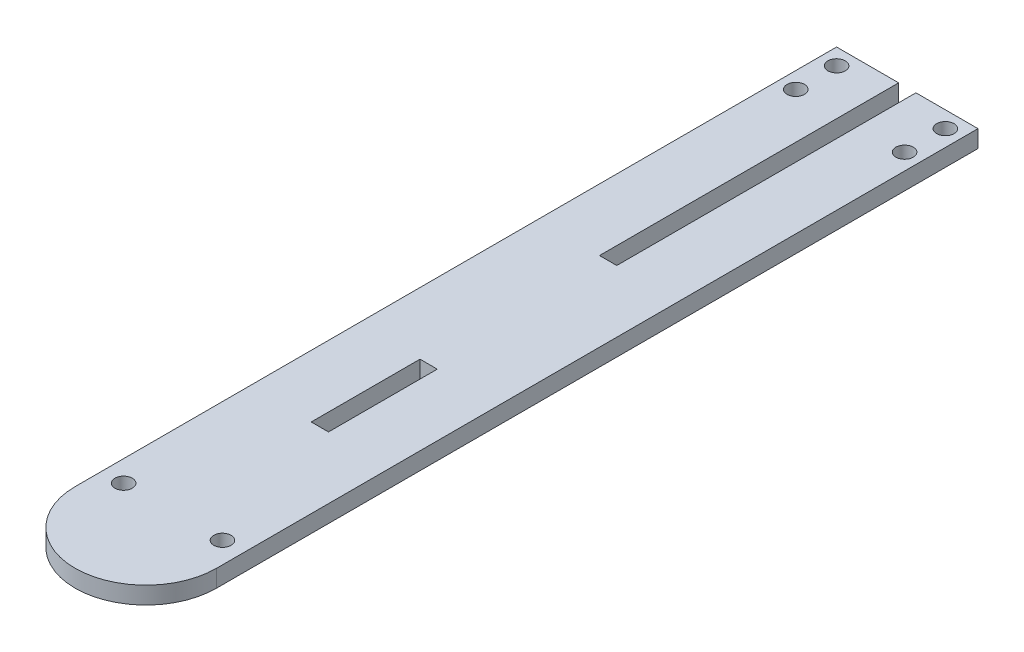
ISO-10303-21;
HEADER;
FILE_DESCRIPTION(('STEP AP214'),'2;1');
FILE_NAME('part.step','',(''),(''),'','','');
FILE_SCHEMA(('AUTOMOTIVE_DESIGN { 1 0 10303 214 1 1 1 1 }'));
ENDSEC;
DATA;
#1=APPLICATION_CONTEXT('core data for automotive mechanical design processes');
#2=APPLICATION_PROTOCOL_DEFINITION('international standard','automotive_design',2000,#1);
#3=PRODUCT_CONTEXT('',#1,'mechanical');
#4=PRODUCT('Part','Part','',(#3));
#5=PRODUCT_RELATED_PRODUCT_CATEGORY('part','',(#4));
#6=PRODUCT_DEFINITION_FORMATION('','',#4);
#7=PRODUCT_DEFINITION_CONTEXT('part definition',#1,'design');
#8=PRODUCT_DEFINITION('design','',#6,#7);
#9=PRODUCT_DEFINITION_SHAPE('','',#8);
#10=(LENGTH_UNIT() NAMED_UNIT(*) SI_UNIT(.MILLI.,.METRE.));
#11=(NAMED_UNIT(*) PLANE_ANGLE_UNIT() SI_UNIT($,.RADIAN.));
#12=(NAMED_UNIT(*) SI_UNIT($,.STERADIAN.) SOLID_ANGLE_UNIT());
#13=UNCERTAINTY_MEASURE_WITH_UNIT(LENGTH_MEASURE(1.E-05),#10,'distance_accuracy_value','');
#14=(GEOMETRIC_REPRESENTATION_CONTEXT(3) GLOBAL_UNCERTAINTY_ASSIGNED_CONTEXT((#13)) GLOBAL_UNIT_ASSIGNED_CONTEXT((#10,
#11,#12)) REPRESENTATION_CONTEXT('',''));
#15=CARTESIAN_POINT('',(0.,0.,0.));
#16=DIRECTION('',(0.,0.,1.));
#17=DIRECTION('',(1.,0.,0.));
#18=AXIS2_PLACEMENT_3D('',#15,#16,#17);
#19=CARTESIAN_POINT('',(-1.58749999999998,3.175,140.));
#20=DIRECTION('',(0.,1.,0.));
#21=DIRECTION('',(0.,0.,1.));
#22=AXIS2_PLACEMENT_3D('',#19,#20,#21);
#23=PLANE('',#22);
#24=CARTESIAN_POINT('',(-10.675,3.175,135.));
#25=DIRECTION('',(0.,1.,0.));
#26=DIRECTION('',(0.,0.,1.));
#27=AXIS2_PLACEMENT_3D('',#24,#25,#26);
#28=CIRCLE('',#27,1.59999999999999);
#29=CARTESIAN_POINT('',(-10.675,3.175,136.6));
#30=VERTEX_POINT('',#29);
#31=EDGE_CURVE('E419',#30,#30,#28,.T.);
#32=ORIENTED_EDGE('',*,*,#31,.F.);
#33=EDGE_LOOP('',(#32));
#34=FACE_BOUND('',#33,.T.);
#35=CARTESIAN_POINT('',(7.50000000000002,3.175,135.));
#36=DIRECTION('',(0.,1.,0.));
#37=DIRECTION('',(0.,0.,1.));
#38=AXIS2_PLACEMENT_3D('',#35,#36,#37);
#39=CIRCLE('',#38,1.59999999999999);
#40=CARTESIAN_POINT('',(7.50000000000002,3.175,136.6));
#41=VERTEX_POINT('',#40);
#42=EDGE_CURVE('E424',#41,#41,#39,.T.);
#43=ORIENTED_EDGE('',*,*,#42,.F.);
#44=EDGE_LOOP('',(#43));
#45=FACE_BOUND('',#44,.T.);
#46=CARTESIAN_POINT('',(-11.5875,3.175,3.00000000000001));
#47=DIRECTION('',(0.,-1.,0.));
#48=DIRECTION('',(0.,0.,-1.));
#49=AXIS2_PLACEMENT_3D('',#46,#47,#48);
#50=CIRCLE('',#49,1.6);
#51=CARTESIAN_POINT('',(-11.5875,3.175,1.40000000000001));
#52=VERTEX_POINT('',#51);
#53=EDGE_CURVE('E416',#52,#52,#50,.T.);
#54=ORIENTED_EDGE('',*,*,#53,.T.);
#55=EDGE_LOOP('',(#54));
#56=FACE_BOUND('',#55,.T.);
#57=CARTESIAN_POINT('',(-11.5875,3.175,10.5));
#58=DIRECTION('',(0.,-1.,0.));
#59=DIRECTION('',(0.,0.,-1.));
#60=AXIS2_PLACEMENT_3D('',#57,#58,#59);
#61=CIRCLE('',#60,1.6);
#62=CARTESIAN_POINT('',(-11.5875,3.175,8.90000000000001));
#63=VERTEX_POINT('',#62);
#64=EDGE_CURVE('E412',#63,#63,#61,.T.);
#65=ORIENTED_EDGE('',*,*,#64,.T.);
#66=EDGE_LOOP('',(#65));
#67=FACE_BOUND('',#66,.T.);
#68=CARTESIAN_POINT('',(8.41250000000003,3.175,10.5));
#69=DIRECTION('',(0.,-1.,0.));
#70=DIRECTION('',(0.,0.,-1.));
#71=AXIS2_PLACEMENT_3D('',#68,#69,#70);
#72=CIRCLE('',#71,1.6);
#73=CARTESIAN_POINT('',(8.41250000000003,3.175,8.9));
#74=VERTEX_POINT('',#73);
#75=EDGE_CURVE('E405',#74,#74,#72,.T.);
#76=ORIENTED_EDGE('',*,*,#75,.T.);
#77=EDGE_LOOP('',(#76));
#78=FACE_BOUND('',#77,.T.);
#79=CARTESIAN_POINT('',(8.41250000000003,3.175,3.00000000000001));
#80=DIRECTION('',(0.,-1.,0.));
#81=DIRECTION('',(0.,0.,-1.));
#82=AXIS2_PLACEMENT_3D('',#79,#80,#81);
#83=CIRCLE('',#82,1.6);
#84=CARTESIAN_POINT('',(8.41250000000003,3.175,1.40000000000001));
#85=VERTEX_POINT('',#84);
#86=EDGE_CURVE('E217',#85,#85,#83,.T.);
#87=ORIENTED_EDGE('',*,*,#86,.T.);
#88=EDGE_LOOP('',(#87));
#89=FACE_BOUND('',#88,.T.);
#90=DIRECTION('',(-1.,0.,0.));
#91=VECTOR('',#90,1.);
#92=CARTESIAN_POINT('',(-14.5875,3.175,0.));
#93=LINE('',#92,#91);
#94=CARTESIAN_POINT('',(-3.175,3.175,0.));
#95=VERTEX_POINT('',#94);
#96=CARTESIAN_POINT('',(-14.5875,3.175,0.));
#97=VERTEX_POINT('',#96);
#98=EDGE_CURVE('E160',#95,#97,#93,.T.);
#99=ORIENTED_EDGE('',*,*,#98,.T.);
#100=DIRECTION('',(0.,0.,1.));
#101=VECTOR('',#100,1.);
#102=CARTESIAN_POINT('',(-14.5875,3.175,0.));
#103=LINE('',#102,#101);
#104=CARTESIAN_POINT('',(-14.5875,3.175,140.));
#105=VERTEX_POINT('',#104);
#106=EDGE_CURVE('E163',#97,#105,#103,.T.);
#107=ORIENTED_EDGE('',*,*,#106,.T.);
#108=CARTESIAN_POINT('',(-1.58749999999998,3.175,140.));
#109=DIRECTION('',(0.,1.,0.));
#110=DIRECTION('',(0.,0.,1.));
#111=AXIS2_PLACEMENT_3D('',#108,#109,#110);
#112=CIRCLE('',#111,13.);
#113=CARTESIAN_POINT('',(11.4125,3.175,140.));
#114=VERTEX_POINT('',#113);
#115=EDGE_CURVE('E166',#105,#114,#112,.T.);
#116=ORIENTED_EDGE('',*,*,#115,.T.);
#117=DIRECTION('',(0.,0.,-1.));
#118=VECTOR('',#117,1.);
#119=CARTESIAN_POINT('',(11.4125,3.175,0.));
#120=LINE('',#119,#118);
#121=CARTESIAN_POINT('',(11.4125,3.175,0.));
#122=VERTEX_POINT('',#121);
#123=EDGE_CURVE('E168',#114,#122,#120,.T.);
#124=ORIENTED_EDGE('',*,*,#123,.T.);
#125=DIRECTION('',(-1.,0.,0.));
#126=VECTOR('',#125,1.);
#127=CARTESIAN_POINT('',(11.4125,3.175,0.));
#128=LINE('',#127,#126);
#129=CARTESIAN_POINT('',(0.,3.175,0.));
#130=VERTEX_POINT('',#129);
#131=EDGE_CURVE('E170',#122,#130,#128,.T.);
#132=ORIENTED_EDGE('',*,*,#131,.T.);
#133=DIRECTION('',(0.,0.,1.));
#134=VECTOR('',#133,1.);
#135=CARTESIAN_POINT('',(0.,3.175,0.));
#136=LINE('',#135,#134);
#137=CARTESIAN_POINT('',(0.,3.175,55.));
#138=VERTEX_POINT('',#137);
#139=EDGE_CURVE('E172',#130,#138,#136,.T.);
#140=ORIENTED_EDGE('',*,*,#139,.T.);
#141=DIRECTION('',(-1.,0.,0.));
#142=VECTOR('',#141,1.);
#143=CARTESIAN_POINT('',(-3.175,3.175,55.));
#144=LINE('',#143,#142);
#145=CARTESIAN_POINT('',(-3.175,3.175,55.));
#146=VERTEX_POINT('',#145);
#147=EDGE_CURVE('E174',#138,#146,#144,.T.);
#148=ORIENTED_EDGE('',*,*,#147,.T.);
#149=DIRECTION('',(0.,0.,-1.));
#150=VECTOR('',#149,1.);
#151=CARTESIAN_POINT('',(-3.175,3.175,0.));
#152=LINE('',#151,#150);
#153=EDGE_CURVE('E176',#146,#95,#152,.T.);
#154=ORIENTED_EDGE('',*,*,#153,.T.);
#155=EDGE_LOOP('',(#99,#107,#116,#124,#132,#140,#148,#154));
#156=FACE_BOUND('',#155,.T.);
#157=DIRECTION('',(1.,0.,0.));
#158=VECTOR('',#157,1.);
#159=CARTESIAN_POINT('',(-3.175,3.175,108.));
#160=LINE('',#159,#158);
#161=CARTESIAN_POINT('',(-3.175,3.175,108.));
#162=VERTEX_POINT('',#161);
#163=CARTESIAN_POINT('',(0.,3.175,108.));
#164=VERTEX_POINT('',#163);
#165=EDGE_CURVE('E131',#162,#164,#160,.T.);
#166=ORIENTED_EDGE('',*,*,#165,.F.);
#167=DIRECTION('',(0.,0.,1.));
#168=VECTOR('',#167,1.);
#169=CARTESIAN_POINT('',(-3.175,3.175,88.));
#170=LINE('',#169,#168);
#171=CARTESIAN_POINT('',(-3.175,3.175,88.));
#172=VERTEX_POINT('',#171);
#173=EDGE_CURVE('E123',#172,#162,#170,.T.);
#174=ORIENTED_EDGE('',*,*,#173,.F.);
#175=DIRECTION('',(-1.,0.,0.));
#176=VECTOR('',#175,1.);
#177=CARTESIAN_POINT('',(-3.175,3.175,88.));
#178=LINE('',#177,#176);
#179=CARTESIAN_POINT('',(0.,3.175,88.));
#180=VERTEX_POINT('',#179);
#181=EDGE_CURVE('E145',#180,#172,#178,.T.);
#182=ORIENTED_EDGE('',*,*,#181,.F.);
#183=DIRECTION('',(0.,0.,-1.));
#184=VECTOR('',#183,1.);
#185=CARTESIAN_POINT('',(0.,3.175,88.));
#186=LINE('',#185,#184);
#187=EDGE_CURVE('E143',#164,#180,#186,.T.);
#188=ORIENTED_EDGE('',*,*,#187,.F.);
#189=EDGE_LOOP('',(#166,#174,#182,#188));
#190=FACE_BOUND('',#189,.T.);
#191=ADVANCED_FACE('F32',(#34,#45,#56,#67,#78,#89,#156,#190),#23,.T.);
#192=CARTESIAN_POINT('',(-1.58749999999998,0.,140.));
#193=DIRECTION('',(0.,1.,0.));
#194=DIRECTION('',(0.,0.,1.));
#195=AXIS2_PLACEMENT_3D('',#192,#193,#194);
#196=PLANE('',#195);
#197=CARTESIAN_POINT('',(-10.675,0.,135.));
#198=DIRECTION('',(0.,1.,0.));
#199=DIRECTION('',(0.,0.,1.));
#200=AXIS2_PLACEMENT_3D('',#197,#198,#199);
#201=CIRCLE('',#200,1.59999999999999);
#202=CARTESIAN_POINT('',(-10.675,0.,136.6));
#203=VERTEX_POINT('',#202);
#204=EDGE_CURVE('E426',#203,#203,#201,.T.);
#205=ORIENTED_EDGE('',*,*,#204,.T.);
#206=EDGE_LOOP('',(#205));
#207=FACE_BOUND('',#206,.T.);
#208=CARTESIAN_POINT('',(7.50000000000002,0.,135.));
#209=DIRECTION('',(0.,1.,0.));
#210=DIRECTION('',(0.,0.,1.));
#211=AXIS2_PLACEMENT_3D('',#208,#209,#210);
#212=CIRCLE('',#211,1.59999999999999);
#213=CARTESIAN_POINT('',(7.50000000000002,0.,136.6));
#214=VERTEX_POINT('',#213);
#215=EDGE_CURVE('E429',#214,#214,#212,.T.);
#216=ORIENTED_EDGE('',*,*,#215,.T.);
#217=EDGE_LOOP('',(#216));
#218=FACE_BOUND('',#217,.T.);
#219=CARTESIAN_POINT('',(-11.5875,0.,3.00000000000001));
#220=DIRECTION('',(0.,1.,0.));
#221=DIRECTION('',(0.,0.,1.));
#222=AXIS2_PLACEMENT_3D('',#219,#220,#221);
#223=CIRCLE('',#222,1.6);
#224=CARTESIAN_POINT('',(-11.5875,0.,4.60000000000002));
#225=VERTEX_POINT('',#224);
#226=EDGE_CURVE('E36',#225,#225,#223,.T.);
#227=ORIENTED_EDGE('',*,*,#226,.T.);
#228=EDGE_LOOP('',(#227));
#229=FACE_BOUND('',#228,.T.);
#230=CARTESIAN_POINT('',(-11.5875,0.,10.5));
#231=DIRECTION('',(0.,1.,0.));
#232=DIRECTION('',(0.,0.,1.));
#233=AXIS2_PLACEMENT_3D('',#230,#231,#232);
#234=CIRCLE('',#233,1.6);
#235=CARTESIAN_POINT('',(-11.5875,0.,12.1));
#236=VERTEX_POINT('',#235);
#237=EDGE_CURVE('E219',#236,#236,#234,.T.);
#238=ORIENTED_EDGE('',*,*,#237,.T.);
#239=EDGE_LOOP('',(#238));
#240=FACE_BOUND('',#239,.T.);
#241=CARTESIAN_POINT('',(8.41250000000003,0.,10.5));
#242=DIRECTION('',(0.,1.,0.));
#243=DIRECTION('',(0.,0.,1.));
#244=AXIS2_PLACEMENT_3D('',#241,#242,#243);
#245=CIRCLE('',#244,1.6);
#246=CARTESIAN_POINT('',(8.41250000000003,0.,12.1));
#247=VERTEX_POINT('',#246);
#248=EDGE_CURVE('E216',#247,#247,#245,.T.);
#249=ORIENTED_EDGE('',*,*,#248,.T.);
#250=EDGE_LOOP('',(#249));
#251=FACE_BOUND('',#250,.T.);
#252=CARTESIAN_POINT('',(8.41250000000003,0.,3.00000000000001));
#253=DIRECTION('',(0.,1.,0.));
#254=DIRECTION('',(0.,0.,1.));
#255=AXIS2_PLACEMENT_3D('',#252,#253,#254);
#256=CIRCLE('',#255,1.6);
#257=CARTESIAN_POINT('',(8.41250000000003,0.,4.6));
#258=VERTEX_POINT('',#257);
#259=EDGE_CURVE('E213',#258,#258,#256,.T.);
#260=ORIENTED_EDGE('',*,*,#259,.T.);
#261=EDGE_LOOP('',(#260));
#262=FACE_BOUND('',#261,.T.);
#263=DIRECTION('',(-1.,0.,0.));
#264=VECTOR('',#263,1.);
#265=CARTESIAN_POINT('',(-14.5875,0.,0.));
#266=LINE('',#265,#264);
#267=CARTESIAN_POINT('',(-3.175,0.,0.));
#268=VERTEX_POINT('',#267);
#269=CARTESIAN_POINT('',(-14.5875,0.,0.));
#270=VERTEX_POINT('',#269);
#271=EDGE_CURVE('E139',#268,#270,#266,.T.);
#272=ORIENTED_EDGE('',*,*,#271,.F.);
#273=DIRECTION('',(0.,0.,-1.));
#274=VECTOR('',#273,1.);
#275=CARTESIAN_POINT('',(-3.175,0.,0.));
#276=LINE('',#275,#274);
#277=CARTESIAN_POINT('',(-3.175,0.,55.));
#278=VERTEX_POINT('',#277);
#279=EDGE_CURVE('E164',#278,#268,#276,.T.);
#280=ORIENTED_EDGE('',*,*,#279,.F.);
#281=DIRECTION('',(-1.,0.,0.));
#282=VECTOR('',#281,1.);
#283=CARTESIAN_POINT('',(-3.175,0.,55.));
#284=LINE('',#283,#282);
#285=CARTESIAN_POINT('',(0.,0.,55.));
#286=VERTEX_POINT('',#285);
#287=EDGE_CURVE('E191',#286,#278,#284,.T.);
#288=ORIENTED_EDGE('',*,*,#287,.F.);
#289=DIRECTION('',(0.,0.,1.));
#290=VECTOR('',#289,1.);
#291=CARTESIAN_POINT('',(0.,0.,0.));
#292=LINE('',#291,#290);
#293=CARTESIAN_POINT('',(0.,0.,0.));
#294=VERTEX_POINT('',#293);
#295=EDGE_CURVE('E189',#294,#286,#292,.T.);
#296=ORIENTED_EDGE('',*,*,#295,.F.);
#297=DIRECTION('',(-1.,0.,0.));
#298=VECTOR('',#297,1.);
#299=CARTESIAN_POINT('',(11.4125,0.,0.));
#300=LINE('',#299,#298);
#301=CARTESIAN_POINT('',(11.4125,0.,0.));
#302=VERTEX_POINT('',#301);
#303=EDGE_CURVE('E187',#302,#294,#300,.T.);
#304=ORIENTED_EDGE('',*,*,#303,.F.);
#305=DIRECTION('',(0.,0.,-1.));
#306=VECTOR('',#305,1.);
#307=CARTESIAN_POINT('',(11.4125,0.,0.));
#308=LINE('',#307,#306);
#309=CARTESIAN_POINT('',(11.4125,0.,140.));
#310=VERTEX_POINT('',#309);
#311=EDGE_CURVE('E185',#310,#302,#308,.T.);
#312=ORIENTED_EDGE('',*,*,#311,.F.);
#313=CARTESIAN_POINT('',(-1.58749999999998,0.,140.));
#314=DIRECTION('',(0.,1.,0.));
#315=DIRECTION('',(0.,0.,1.));
#316=AXIS2_PLACEMENT_3D('',#313,#314,#315);
#317=CIRCLE('',#316,13.);
#318=CARTESIAN_POINT('',(-14.5875,0.,140.));
#319=VERTEX_POINT('',#318);
#320=EDGE_CURVE('E183',#319,#310,#317,.T.);
#321=ORIENTED_EDGE('',*,*,#320,.F.);
#322=DIRECTION('',(0.,0.,1.));
#323=VECTOR('',#322,1.);
#324=CARTESIAN_POINT('',(-14.5875,0.,0.));
#325=LINE('',#324,#323);
#326=EDGE_CURVE('E181',#270,#319,#325,.T.);
#327=ORIENTED_EDGE('',*,*,#326,.F.);
#328=EDGE_LOOP('',(#272,#280,#288,#296,#304,#312,#321,#327));
#329=FACE_BOUND('',#328,.T.);
#330=DIRECTION('',(0.,0.,1.));
#331=VECTOR('',#330,1.);
#332=CARTESIAN_POINT('',(-3.175,0.,88.));
#333=LINE('',#332,#331);
#334=CARTESIAN_POINT('',(-3.175,0.,88.));
#335=VERTEX_POINT('',#334);
#336=CARTESIAN_POINT('',(-3.175,0.,108.));
#337=VERTEX_POINT('',#336);
#338=EDGE_CURVE('E57',#335,#337,#333,.T.);
#339=ORIENTED_EDGE('',*,*,#338,.T.);
#340=DIRECTION('',(1.,0.,0.));
#341=VECTOR('',#340,1.);
#342=CARTESIAN_POINT('',(-3.175,0.,108.));
#343=LINE('',#342,#341);
#344=CARTESIAN_POINT('',(0.,0.,108.));
#345=VERTEX_POINT('',#344);
#346=EDGE_CURVE('E138',#337,#345,#343,.T.);
#347=ORIENTED_EDGE('',*,*,#346,.T.);
#348=DIRECTION('',(0.,0.,-1.));
#349=VECTOR('',#348,1.);
#350=CARTESIAN_POINT('',(0.,0.,88.));
#351=LINE('',#350,#349);
#352=CARTESIAN_POINT('',(0.,0.,88.));
#353=VERTEX_POINT('',#352);
#354=EDGE_CURVE('E152',#345,#353,#351,.T.);
#355=ORIENTED_EDGE('',*,*,#354,.T.);
#356=DIRECTION('',(-1.,0.,0.));
#357=VECTOR('',#356,1.);
#358=CARTESIAN_POINT('',(-3.175,0.,88.));
#359=LINE('',#358,#357);
#360=EDGE_CURVE('E132',#353,#335,#359,.T.);
#361=ORIENTED_EDGE('',*,*,#360,.T.);
#362=EDGE_LOOP('',(#339,#347,#355,#361));
#363=FACE_BOUND('',#362,.T.);
#364=ADVANCED_FACE('F226',(#207,#218,#229,#240,#251,#262,#329,#363),#196,.F.);
#365=CARTESIAN_POINT('',(-14.5875,3.175,0.));
#366=DIRECTION('',(0.,0.,1.));
#367=DIRECTION('',(1.,0.,0.));
#368=AXIS2_PLACEMENT_3D('',#365,#366,#367);
#369=PLANE('',#368);
#370=ORIENTED_EDGE('',*,*,#271,.T.);
#371=DIRECTION('',(0.,-1.,0.));
#372=VECTOR('',#371,1.);
#373=CARTESIAN_POINT('',(-14.5875,3.175,0.));
#374=LINE('',#373,#372);
#375=EDGE_CURVE('E11',#97,#270,#374,.T.);
#376=ORIENTED_EDGE('',*,*,#375,.F.);
#377=ORIENTED_EDGE('',*,*,#98,.F.);
#378=DIRECTION('',(0.,-1.,0.));
#379=VECTOR('',#378,1.);
#380=CARTESIAN_POINT('',(-3.175,3.175,0.));
#381=LINE('',#380,#379);
#382=EDGE_CURVE('E178',#95,#268,#381,.T.);
#383=ORIENTED_EDGE('',*,*,#382,.T.);
#384=EDGE_LOOP('',(#370,#376,#377,#383));
#385=FACE_BOUND('',#384,.T.);
#386=ADVANCED_FACE('F34',(#385),#369,.F.);
#387=CARTESIAN_POINT('',(-14.5875,3.175,0.));
#388=DIRECTION('',(1.,0.,0.));
#389=DIRECTION('',(0.,0.,-1.));
#390=AXIS2_PLACEMENT_3D('',#387,#388,#389);
#391=PLANE('',#390);
#392=ORIENTED_EDGE('',*,*,#326,.T.);
#393=DIRECTION('',(0.,-1.,0.));
#394=VECTOR('',#393,1.);
#395=CARTESIAN_POINT('',(-14.5875,3.175,140.));
#396=LINE('',#395,#394);
#397=EDGE_CURVE('E41',#105,#319,#396,.T.);
#398=ORIENTED_EDGE('',*,*,#397,.F.);
#399=ORIENTED_EDGE('',*,*,#106,.F.);
#400=ORIENTED_EDGE('',*,*,#375,.T.);
#401=EDGE_LOOP('',(#392,#398,#399,#400));
#402=FACE_BOUND('',#401,.T.);
#403=ADVANCED_FACE('F281',(#402),#391,.F.);
#404=CARTESIAN_POINT('',(-1.58749999999998,3.175,140.));
#405=DIRECTION('',(0.,-1.,0.));
#406=DIRECTION('',(0.,0.,-1.));
#407=AXIS2_PLACEMENT_3D('',#404,#405,#406);
#408=CYLINDRICAL_SURFACE('',#407,13.);
#409=ORIENTED_EDGE('',*,*,#320,.T.);
#410=DIRECTION('',(0.,-1.,0.));
#411=VECTOR('',#410,1.);
#412=CARTESIAN_POINT('',(11.4125,3.175,140.));
#413=LINE('',#412,#411);
#414=EDGE_CURVE('E208',#114,#310,#413,.T.);
#415=ORIENTED_EDGE('',*,*,#414,.F.);
#416=ORIENTED_EDGE('',*,*,#115,.F.);
#417=ORIENTED_EDGE('',*,*,#397,.T.);
#418=EDGE_LOOP('',(#409,#415,#416,#417));
#419=FACE_BOUND('',#418,.T.);
#420=ADVANCED_FACE('F278',(#419),#408,.T.);
#421=CARTESIAN_POINT('',(11.4125,3.175,0.));
#422=DIRECTION('',(-1.,0.,0.));
#423=DIRECTION('',(0.,0.,1.));
#424=AXIS2_PLACEMENT_3D('',#421,#422,#423);
#425=PLANE('',#424);
#426=ORIENTED_EDGE('',*,*,#311,.T.);
#427=DIRECTION('',(0.,-1.,0.));
#428=VECTOR('',#427,1.);
#429=CARTESIAN_POINT('',(11.4125,3.175,0.));
#430=LINE('',#429,#428);
#431=EDGE_CURVE('E205',#122,#302,#430,.T.);
#432=ORIENTED_EDGE('',*,*,#431,.F.);
#433=ORIENTED_EDGE('',*,*,#123,.F.);
#434=ORIENTED_EDGE('',*,*,#414,.T.);
#435=EDGE_LOOP('',(#426,#432,#433,#434));
#436=FACE_BOUND('',#435,.T.);
#437=ADVANCED_FACE('F274',(#436),#425,.F.);
#438=CARTESIAN_POINT('',(11.4125,3.175,0.));
#439=DIRECTION('',(0.,0.,1.));
#440=DIRECTION('',(1.,0.,0.));
#441=AXIS2_PLACEMENT_3D('',#438,#439,#440);
#442=PLANE('',#441);
#443=ORIENTED_EDGE('',*,*,#303,.T.);
#444=DIRECTION('',(0.,-1.,0.));
#445=VECTOR('',#444,1.);
#446=CARTESIAN_POINT('',(0.,3.175,0.));
#447=LINE('',#446,#445);
#448=EDGE_CURVE('E202',#130,#294,#447,.T.);
#449=ORIENTED_EDGE('',*,*,#448,.F.);
#450=ORIENTED_EDGE('',*,*,#131,.F.);
#451=ORIENTED_EDGE('',*,*,#431,.T.);
#452=EDGE_LOOP('',(#443,#449,#450,#451));
#453=FACE_BOUND('',#452,.T.);
#454=ADVANCED_FACE('F270',(#453),#442,.F.);
#455=CARTESIAN_POINT('',(0.,3.175,0.));
#456=DIRECTION('',(1.,0.,0.));
#457=DIRECTION('',(0.,0.,-1.));
#458=AXIS2_PLACEMENT_3D('',#455,#456,#457);
#459=PLANE('',#458);
#460=ORIENTED_EDGE('',*,*,#295,.T.);
#461=DIRECTION('',(0.,-1.,0.));
#462=VECTOR('',#461,1.);
#463=CARTESIAN_POINT('',(0.,3.175,55.));
#464=LINE('',#463,#462);
#465=EDGE_CURVE('E199',#138,#286,#464,.T.);
#466=ORIENTED_EDGE('',*,*,#465,.F.);
#467=ORIENTED_EDGE('',*,*,#139,.F.);
#468=ORIENTED_EDGE('',*,*,#448,.T.);
#469=EDGE_LOOP('',(#460,#466,#467,#468));
#470=FACE_BOUND('',#469,.T.);
#471=ADVANCED_FACE('F266',(#470),#459,.F.);
#472=CARTESIAN_POINT('',(-3.175,3.175,55.));
#473=DIRECTION('',(0.,0.,1.));
#474=DIRECTION('',(1.,0.,0.));
#475=AXIS2_PLACEMENT_3D('',#472,#473,#474);
#476=PLANE('',#475);
#477=ORIENTED_EDGE('',*,*,#287,.T.);
#478=DIRECTION('',(0.,-1.,0.));
#479=VECTOR('',#478,1.);
#480=CARTESIAN_POINT('',(-3.175,3.175,55.));
#481=LINE('',#480,#479);
#482=EDGE_CURVE('E196',#146,#278,#481,.T.);
#483=ORIENTED_EDGE('',*,*,#482,.F.);
#484=ORIENTED_EDGE('',*,*,#147,.F.);
#485=ORIENTED_EDGE('',*,*,#465,.T.);
#486=EDGE_LOOP('',(#477,#483,#484,#485));
#487=FACE_BOUND('',#486,.T.);
#488=ADVANCED_FACE('F262',(#487),#476,.F.);
#489=CARTESIAN_POINT('',(-3.175,3.175,0.));
#490=DIRECTION('',(-1.,0.,0.));
#491=DIRECTION('',(0.,0.,1.));
#492=AXIS2_PLACEMENT_3D('',#489,#490,#491);
#493=PLANE('',#492);
#494=ORIENTED_EDGE('',*,*,#279,.T.);
#495=ORIENTED_EDGE('',*,*,#382,.F.);
#496=ORIENTED_EDGE('',*,*,#153,.F.);
#497=ORIENTED_EDGE('',*,*,#482,.T.);
#498=EDGE_LOOP('',(#494,#495,#496,#497));
#499=FACE_BOUND('',#498,.T.);
#500=ADVANCED_FACE('F259',(#499),#493,.F.);
#501=CARTESIAN_POINT('',(-3.175,3.175,88.));
#502=DIRECTION('',(1.,0.,0.));
#503=DIRECTION('',(0.,0.,-1.));
#504=AXIS2_PLACEMENT_3D('',#501,#502,#503);
#505=PLANE('',#504);
#506=ORIENTED_EDGE('',*,*,#338,.F.);
#507=DIRECTION('',(0.,-1.,0.));
#508=VECTOR('',#507,1.);
#509=CARTESIAN_POINT('',(-3.175,3.175,88.));
#510=LINE('',#509,#508);
#511=EDGE_CURVE('E127',#172,#335,#510,.T.);
#512=ORIENTED_EDGE('',*,*,#511,.F.);
#513=ORIENTED_EDGE('',*,*,#173,.T.);
#514=DIRECTION('',(0.,-1.,0.));
#515=VECTOR('',#514,1.);
#516=CARTESIAN_POINT('',(-3.175,3.175,108.));
#517=LINE('',#516,#515);
#518=EDGE_CURVE('E126',#162,#337,#517,.T.);
#519=ORIENTED_EDGE('',*,*,#518,.T.);
#520=EDGE_LOOP('',(#506,#512,#513,#519));
#521=FACE_BOUND('',#520,.T.);
#522=ADVANCED_FACE('F125',(#521),#505,.T.);
#523=CARTESIAN_POINT('',(-3.175,3.175,108.));
#524=DIRECTION('',(0.,0.,-1.));
#525=DIRECTION('',(-1.,0.,0.));
#526=AXIS2_PLACEMENT_3D('',#523,#524,#525);
#527=PLANE('',#526);
#528=ORIENTED_EDGE('',*,*,#346,.F.);
#529=ORIENTED_EDGE('',*,*,#518,.F.);
#530=ORIENTED_EDGE('',*,*,#165,.T.);
#531=DIRECTION('',(0.,-1.,0.));
#532=VECTOR('',#531,1.);
#533=CARTESIAN_POINT('',(0.,3.175,108.));
#534=LINE('',#533,#532);
#535=EDGE_CURVE('E140',#164,#345,#534,.T.);
#536=ORIENTED_EDGE('',*,*,#535,.T.);
#537=EDGE_LOOP('',(#528,#529,#530,#536));
#538=FACE_BOUND('',#537,.T.);
#539=ADVANCED_FACE('F135',(#538),#527,.T.);
#540=CARTESIAN_POINT('',(0.,3.175,88.));
#541=DIRECTION('',(-1.,0.,0.));
#542=DIRECTION('',(0.,0.,1.));
#543=AXIS2_PLACEMENT_3D('',#540,#541,#542);
#544=PLANE('',#543);
#545=ORIENTED_EDGE('',*,*,#354,.F.);
#546=ORIENTED_EDGE('',*,*,#535,.F.);
#547=ORIENTED_EDGE('',*,*,#187,.T.);
#548=DIRECTION('',(0.,-1.,0.));
#549=VECTOR('',#548,1.);
#550=CARTESIAN_POINT('',(0.,3.175,88.));
#551=LINE('',#550,#549);
#552=EDGE_CURVE('E49',#180,#353,#551,.T.);
#553=ORIENTED_EDGE('',*,*,#552,.T.);
#554=EDGE_LOOP('',(#545,#546,#547,#553));
#555=FACE_BOUND('',#554,.T.);
#556=ADVANCED_FACE('F318',(#555),#544,.T.);
#557=CARTESIAN_POINT('',(-3.175,3.175,88.));
#558=DIRECTION('',(0.,0.,1.));
#559=DIRECTION('',(1.,0.,0.));
#560=AXIS2_PLACEMENT_3D('',#557,#558,#559);
#561=PLANE('',#560);
#562=ORIENTED_EDGE('',*,*,#360,.F.);
#563=ORIENTED_EDGE('',*,*,#552,.F.);
#564=ORIENTED_EDGE('',*,*,#181,.T.);
#565=ORIENTED_EDGE('',*,*,#511,.T.);
#566=EDGE_LOOP('',(#562,#563,#564,#565));
#567=FACE_BOUND('',#566,.T.);
#568=ADVANCED_FACE('F315',(#567),#561,.T.);
#569=CARTESIAN_POINT('',(8.41250000000003,3.175,3.00000000000001));
#570=DIRECTION('',(0.,-1.,0.));
#571=DIRECTION('',(0.,0.,-1.));
#572=AXIS2_PLACEMENT_3D('',#569,#570,#571);
#573=CYLINDRICAL_SURFACE('',#572,1.6);
#574=ORIENTED_EDGE('',*,*,#86,.F.);
#575=EDGE_LOOP('',(#574));
#576=FACE_BOUND('',#575,.T.);
#577=ORIENTED_EDGE('',*,*,#259,.F.);
#578=EDGE_LOOP('',(#577));
#579=FACE_BOUND('',#578,.T.);
#580=ADVANCED_FACE('F317',(#576,#579),#573,.F.);
#581=CARTESIAN_POINT('',(8.41250000000003,3.175,10.5));
#582=DIRECTION('',(0.,-1.,0.));
#583=DIRECTION('',(0.,0.,-1.));
#584=AXIS2_PLACEMENT_3D('',#581,#582,#583);
#585=CYLINDRICAL_SURFACE('',#584,1.6);
#586=ORIENTED_EDGE('',*,*,#75,.F.);
#587=EDGE_LOOP('',(#586));
#588=FACE_BOUND('',#587,.T.);
#589=ORIENTED_EDGE('',*,*,#248,.F.);
#590=EDGE_LOOP('',(#589));
#591=FACE_BOUND('',#590,.T.);
#592=ADVANCED_FACE('F241',(#588,#591),#585,.F.);
#593=CARTESIAN_POINT('',(-11.5875,3.175,10.5));
#594=DIRECTION('',(0.,-1.,0.));
#595=DIRECTION('',(0.,0.,-1.));
#596=AXIS2_PLACEMENT_3D('',#593,#594,#595);
#597=CYLINDRICAL_SURFACE('',#596,1.6);
#598=ORIENTED_EDGE('',*,*,#64,.F.);
#599=EDGE_LOOP('',(#598));
#600=FACE_BOUND('',#599,.T.);
#601=ORIENTED_EDGE('',*,*,#237,.F.);
#602=EDGE_LOOP('',(#601));
#603=FACE_BOUND('',#602,.T.);
#604=ADVANCED_FACE('F231',(#600,#603),#597,.F.);
#605=CARTESIAN_POINT('',(-11.5875,3.175,3.00000000000001));
#606=DIRECTION('',(0.,-1.,0.));
#607=DIRECTION('',(0.,0.,-1.));
#608=AXIS2_PLACEMENT_3D('',#605,#606,#607);
#609=CYLINDRICAL_SURFACE('',#608,1.6);
#610=ORIENTED_EDGE('',*,*,#53,.F.);
#611=EDGE_LOOP('',(#610));
#612=FACE_BOUND('',#611,.T.);
#613=ORIENTED_EDGE('',*,*,#226,.F.);
#614=EDGE_LOOP('',(#613));
#615=FACE_BOUND('',#614,.T.);
#616=ADVANCED_FACE('F228',(#612,#615),#609,.F.);
#617=CARTESIAN_POINT('',(7.50000000000002,0.,135.));
#618=DIRECTION('',(0.,1.,0.));
#619=DIRECTION('',(0.,0.,1.));
#620=AXIS2_PLACEMENT_3D('',#617,#618,#619);
#621=CYLINDRICAL_SURFACE('',#620,1.59999999999999);
#622=ORIENTED_EDGE('',*,*,#42,.T.);
#623=EDGE_LOOP('',(#622));
#624=FACE_BOUND('',#623,.T.);
#625=ORIENTED_EDGE('',*,*,#215,.F.);
#626=EDGE_LOOP('',(#625));
#627=FACE_BOUND('',#626,.T.);
#628=ADVANCED_FACE('F230',(#624,#627),#621,.F.);
#629=CARTESIAN_POINT('',(-10.675,0.,135.));
#630=DIRECTION('',(0.,1.,0.));
#631=DIRECTION('',(0.,0.,1.));
#632=AXIS2_PLACEMENT_3D('',#629,#630,#631);
#633=CYLINDRICAL_SURFACE('',#632,1.59999999999999);
#634=ORIENTED_EDGE('',*,*,#31,.T.);
#635=EDGE_LOOP('',(#634));
#636=FACE_BOUND('',#635,.T.);
#637=ORIENTED_EDGE('',*,*,#204,.F.);
#638=EDGE_LOOP('',(#637));
#639=FACE_BOUND('',#638,.T.);
#640=ADVANCED_FACE('F238',(#636,#639),#633,.F.);
#641=CLOSED_SHELL('',(#191,#364,#386,#403,#420,#437,#454,#471,#488,#500,#522,#539,#556,#568,
#580,#592,#604,#616,#628,#640));
#642=MANIFOLD_SOLID_BREP('B2',#641);
#643=ADVANCED_BREP_SHAPE_REPRESENTATION('',(#18,#642),#14);
#644=SHAPE_DEFINITION_REPRESENTATION(#9,#643);
ENDSEC;
END-ISO-10303-21;
